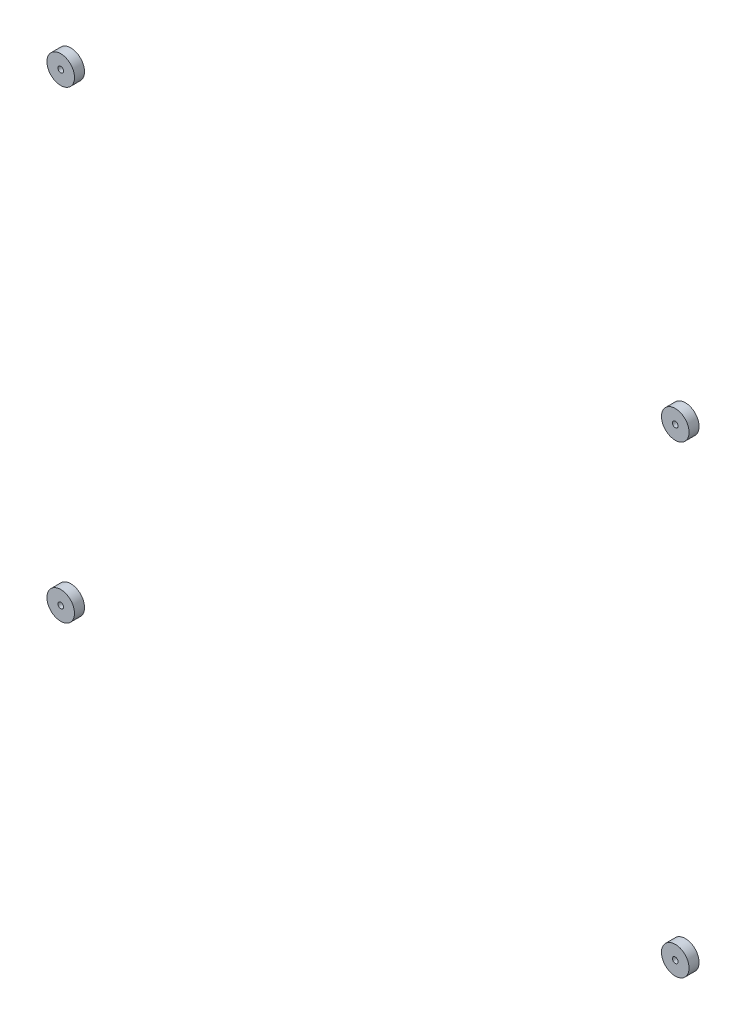
ISO-10303-21;
HEADER;
FILE_DESCRIPTION(('STEP AP214'),'2;1');
FILE_NAME('part.step','',(''),(''),'','','');
FILE_SCHEMA(('AUTOMOTIVE_DESIGN { 1 0 10303 214 1 1 1 1 }'));
ENDSEC;
DATA;
#1=APPLICATION_CONTEXT('core data for automotive mechanical design processes');
#2=APPLICATION_PROTOCOL_DEFINITION('international standard','automotive_design',2000,#1);
#3=PRODUCT_CONTEXT('',#1,'mechanical');
#4=PRODUCT('Part','Part','',(#3));
#5=PRODUCT_RELATED_PRODUCT_CATEGORY('part','',(#4));
#6=PRODUCT_DEFINITION_FORMATION('','',#4);
#7=PRODUCT_DEFINITION_CONTEXT('part definition',#1,'design');
#8=PRODUCT_DEFINITION('design','',#6,#7);
#9=PRODUCT_DEFINITION_SHAPE('','',#8);
#10=(LENGTH_UNIT() NAMED_UNIT(*) SI_UNIT(.MILLI.,.METRE.));
#11=(NAMED_UNIT(*) PLANE_ANGLE_UNIT() SI_UNIT($,.RADIAN.));
#12=(NAMED_UNIT(*) SI_UNIT($,.STERADIAN.) SOLID_ANGLE_UNIT());
#13=UNCERTAINTY_MEASURE_WITH_UNIT(LENGTH_MEASURE(1.E-05),#10,'distance_accuracy_value','');
#14=(GEOMETRIC_REPRESENTATION_CONTEXT(3) GLOBAL_UNCERTAINTY_ASSIGNED_CONTEXT((#13)) GLOBAL_UNIT_ASSIGNED_CONTEXT((#10,
#11,#12)) REPRESENTATION_CONTEXT('',''));
#15=CARTESIAN_POINT('',(0.,0.,0.));
#16=DIRECTION('',(0.,0.,1.));
#17=DIRECTION('',(1.,0.,0.));
#18=AXIS2_PLACEMENT_3D('',#15,#16,#17);
#19=CARTESIAN_POINT('',(-245.,-185.,118.));
#20=DIRECTION('',(0.,0.,1.));
#21=DIRECTION('',(1.,0.,0.));
#22=AXIS2_PLACEMENT_3D('',#19,#20,#21);
#23=PLANE('',#22);
#24=CARTESIAN_POINT('',(-245.,-185.,118.));
#25=DIRECTION('',(0.,0.,1.));
#26=DIRECTION('',(1.,0.,0.));
#27=AXIS2_PLACEMENT_3D('',#24,#25,#26);
#28=CIRCLE('',#27,2.25);
#29=CARTESIAN_POINT('',(-242.75,-185.,118.));
#30=VERTEX_POINT('',#29);
#31=EDGE_CURVE('P0_E32',#30,#30,#28,.T.);
#32=ORIENTED_EDGE('',*,*,#31,.F.);
#33=EDGE_LOOP('',(#32));
#34=FACE_BOUND('',#33,.T.);
#35=CARTESIAN_POINT('',(-245.,-185.,118.));
#36=DIRECTION('',(0.,0.,-1.));
#37=DIRECTION('',(-1.,0.,0.));
#38=AXIS2_PLACEMENT_3D('',#35,#36,#37);
#39=CIRCLE('',#38,11.);
#40=CARTESIAN_POINT('',(-256.,-185.,118.));
#41=VERTEX_POINT('',#40);
#42=EDGE_CURVE('P0_E10',#41,#41,#39,.T.);
#43=ORIENTED_EDGE('',*,*,#42,.F.);
#44=EDGE_LOOP('',(#43));
#45=FACE_BOUND('',#44,.T.);
#46=ADVANCED_FACE('P0_F15',(#34,#45),#23,.T.);
#47=CARTESIAN_POINT('',(-245.,-185.,110.));
#48=DIRECTION('',(0.,0.,-1.));
#49=DIRECTION('',(-1.,0.,0.));
#50=AXIS2_PLACEMENT_3D('',#47,#48,#49);
#51=PLANE('',#50);
#52=CARTESIAN_POINT('',(-245.,-185.,110.));
#53=DIRECTION('',(0.,0.,-1.));
#54=DIRECTION('',(-1.,0.,0.));
#55=AXIS2_PLACEMENT_3D('',#52,#53,#54);
#56=CIRCLE('',#55,2.25);
#57=CARTESIAN_POINT('',(-247.25,-185.,110.));
#58=VERTEX_POINT('',#57);
#59=EDGE_CURVE('P0_E19',#58,#58,#56,.T.);
#60=ORIENTED_EDGE('',*,*,#59,.F.);
#61=EDGE_LOOP('',(#60));
#62=FACE_BOUND('',#61,.T.);
#63=CARTESIAN_POINT('',(-245.,-185.,110.));
#64=DIRECTION('',(0.,0.,1.));
#65=DIRECTION('',(1.,0.,0.));
#66=AXIS2_PLACEMENT_3D('',#63,#64,#65);
#67=CIRCLE('',#66,11.);
#68=CARTESIAN_POINT('',(-234.,-185.,110.));
#69=VERTEX_POINT('',#68);
#70=EDGE_CURVE('P0_E24',#69,#69,#67,.T.);
#71=ORIENTED_EDGE('',*,*,#70,.F.);
#72=EDGE_LOOP('',(#71));
#73=FACE_BOUND('',#72,.T.);
#74=ADVANCED_FACE('P0_F43',(#62,#73),#51,.T.);
#75=CARTESIAN_POINT('',(-245.,-185.,110.));
#76=DIRECTION('',(0.,0.,1.));
#77=DIRECTION('',(1.,0.,0.));
#78=AXIS2_PLACEMENT_3D('',#75,#76,#77);
#79=CYLINDRICAL_SURFACE('',#78,11.);
#80=ORIENTED_EDGE('',*,*,#42,.T.);
#81=EDGE_LOOP('',(#80));
#82=FACE_BOUND('',#81,.T.);
#83=ORIENTED_EDGE('',*,*,#70,.T.);
#84=EDGE_LOOP('',(#83));
#85=FACE_BOUND('',#84,.T.);
#86=ADVANCED_FACE('P0_F17',(#82,#85),#79,.T.);
#87=CARTESIAN_POINT('',(-245.,-185.,109.7));
#88=DIRECTION('',(0.,0.,1.));
#89=DIRECTION('',(1.,0.,0.));
#90=AXIS2_PLACEMENT_3D('',#87,#88,#89);
#91=CYLINDRICAL_SURFACE('',#90,2.25);
#92=ORIENTED_EDGE('',*,*,#31,.T.);
#93=EDGE_LOOP('',(#92));
#94=FACE_BOUND('',#93,.T.);
#95=ORIENTED_EDGE('',*,*,#59,.T.);
#96=EDGE_LOOP('',(#95));
#97=FACE_BOUND('',#96,.T.);
#98=ADVANCED_FACE('P0_F41',(#94,#97),#91,.F.);
#99=CLOSED_SHELL('',(#46,#74,#86,#98));
#100=MANIFOLD_SOLID_BREP('P0_B1',#99);
#101=CARTESIAN_POINT('',(-245.,185.,118.));
#102=DIRECTION('',(0.,0.,1.));
#103=DIRECTION('',(1.,0.,0.));
#104=AXIS2_PLACEMENT_3D('',#101,#102,#103);
#105=PLANE('',#104);
#106=CARTESIAN_POINT('',(-245.,185.,118.));
#107=DIRECTION('',(0.,0.,1.));
#108=DIRECTION('',(1.,0.,0.));
#109=AXIS2_PLACEMENT_3D('',#106,#107,#108);
#110=CIRCLE('',#109,2.25);
#111=CARTESIAN_POINT('',(-242.75,185.,118.));
#112=VERTEX_POINT('',#111);
#113=EDGE_CURVE('P1_E31',#112,#112,#110,.T.);
#114=ORIENTED_EDGE('',*,*,#113,.F.);
#115=EDGE_LOOP('',(#114));
#116=FACE_BOUND('',#115,.T.);
#117=CARTESIAN_POINT('',(-245.,185.,118.));
#118=DIRECTION('',(0.,0.,-1.));
#119=DIRECTION('',(-1.,0.,0.));
#120=AXIS2_PLACEMENT_3D('',#117,#118,#119);
#121=CIRCLE('',#120,11.);
#122=CARTESIAN_POINT('',(-256.,185.,118.));
#123=VERTEX_POINT('',#122);
#124=EDGE_CURVE('P1_E10',#123,#123,#121,.T.);
#125=ORIENTED_EDGE('',*,*,#124,.F.);
#126=EDGE_LOOP('',(#125));
#127=FACE_BOUND('',#126,.T.);
#128=ADVANCED_FACE('P1_F15',(#116,#127),#105,.T.);
#129=CARTESIAN_POINT('',(-245.,185.,110.));
#130=DIRECTION('',(0.,0.,-1.));
#131=DIRECTION('',(-1.,0.,0.));
#132=AXIS2_PLACEMENT_3D('',#129,#130,#131);
#133=PLANE('',#132);
#134=CARTESIAN_POINT('',(-245.,185.,110.));
#135=DIRECTION('',(0.,0.,-1.));
#136=DIRECTION('',(-1.,0.,0.));
#137=AXIS2_PLACEMENT_3D('',#134,#135,#136);
#138=CIRCLE('',#137,2.25);
#139=CARTESIAN_POINT('',(-247.25,185.,110.));
#140=VERTEX_POINT('',#139);
#141=EDGE_CURVE('P1_E19',#140,#140,#138,.T.);
#142=ORIENTED_EDGE('',*,*,#141,.F.);
#143=EDGE_LOOP('',(#142));
#144=FACE_BOUND('',#143,.T.);
#145=CARTESIAN_POINT('',(-245.,185.,110.));
#146=DIRECTION('',(0.,0.,1.));
#147=DIRECTION('',(1.,0.,0.));
#148=AXIS2_PLACEMENT_3D('',#145,#146,#147);
#149=CIRCLE('',#148,11.);
#150=CARTESIAN_POINT('',(-234.,185.,110.));
#151=VERTEX_POINT('',#150);
#152=EDGE_CURVE('P1_E24',#151,#151,#149,.T.);
#153=ORIENTED_EDGE('',*,*,#152,.F.);
#154=EDGE_LOOP('',(#153));
#155=FACE_BOUND('',#154,.T.);
#156=ADVANCED_FACE('P1_F43',(#144,#155),#133,.T.);
#157=CARTESIAN_POINT('',(-245.,185.,110.));
#158=DIRECTION('',(0.,0.,1.));
#159=DIRECTION('',(1.,0.,0.));
#160=AXIS2_PLACEMENT_3D('',#157,#158,#159);
#161=CYLINDRICAL_SURFACE('',#160,11.);
#162=ORIENTED_EDGE('',*,*,#124,.T.);
#163=EDGE_LOOP('',(#162));
#164=FACE_BOUND('',#163,.T.);
#165=ORIENTED_EDGE('',*,*,#152,.T.);
#166=EDGE_LOOP('',(#165));
#167=FACE_BOUND('',#166,.T.);
#168=ADVANCED_FACE('P1_F17',(#164,#167),#161,.T.);
#169=CARTESIAN_POINT('',(-245.,185.,109.7));
#170=DIRECTION('',(0.,0.,1.));
#171=DIRECTION('',(1.,0.,0.));
#172=AXIS2_PLACEMENT_3D('',#169,#170,#171);
#173=CYLINDRICAL_SURFACE('',#172,2.25);
#174=ORIENTED_EDGE('',*,*,#113,.T.);
#175=EDGE_LOOP('',(#174));
#176=FACE_BOUND('',#175,.T.);
#177=ORIENTED_EDGE('',*,*,#141,.T.);
#178=EDGE_LOOP('',(#177));
#179=FACE_BOUND('',#178,.T.);
#180=ADVANCED_FACE('P1_F41',(#176,#179),#173,.F.);
#181=CLOSED_SHELL('',(#128,#156,#168,#180));
#182=MANIFOLD_SOLID_BREP('P1_B1',#181);
#183=CARTESIAN_POINT('',(245.,-185.,118.));
#184=DIRECTION('',(0.,0.,1.));
#185=DIRECTION('',(1.,0.,0.));
#186=AXIS2_PLACEMENT_3D('',#183,#184,#185);
#187=PLANE('',#186);
#188=CARTESIAN_POINT('',(245.,-185.,118.));
#189=DIRECTION('',(0.,0.,1.));
#190=DIRECTION('',(1.,0.,0.));
#191=AXIS2_PLACEMENT_3D('',#188,#189,#190);
#192=CIRCLE('',#191,2.25);
#193=CARTESIAN_POINT('',(247.25,-185.,118.));
#194=VERTEX_POINT('',#193);
#195=EDGE_CURVE('P2_E32',#194,#194,#192,.T.);
#196=ORIENTED_EDGE('',*,*,#195,.F.);
#197=EDGE_LOOP('',(#196));
#198=FACE_BOUND('',#197,.T.);
#199=CARTESIAN_POINT('',(245.,-185.,118.));
#200=DIRECTION('',(0.,0.,-1.));
#201=DIRECTION('',(-1.,0.,0.));
#202=AXIS2_PLACEMENT_3D('',#199,#200,#201);
#203=CIRCLE('',#202,11.);
#204=CARTESIAN_POINT('',(234.,-185.,118.));
#205=VERTEX_POINT('',#204);
#206=EDGE_CURVE('P2_E10',#205,#205,#203,.T.);
#207=ORIENTED_EDGE('',*,*,#206,.F.);
#208=EDGE_LOOP('',(#207));
#209=FACE_BOUND('',#208,.T.);
#210=ADVANCED_FACE('P2_F15',(#198,#209),#187,.T.);
#211=CARTESIAN_POINT('',(245.,-185.,110.));
#212=DIRECTION('',(0.,0.,-1.));
#213=DIRECTION('',(-1.,0.,0.));
#214=AXIS2_PLACEMENT_3D('',#211,#212,#213);
#215=PLANE('',#214);
#216=CARTESIAN_POINT('',(245.,-185.,110.));
#217=DIRECTION('',(0.,0.,-1.));
#218=DIRECTION('',(-1.,0.,0.));
#219=AXIS2_PLACEMENT_3D('',#216,#217,#218);
#220=CIRCLE('',#219,2.25);
#221=CARTESIAN_POINT('',(242.75,-185.,110.));
#222=VERTEX_POINT('',#221);
#223=EDGE_CURVE('P2_E19',#222,#222,#220,.T.);
#224=ORIENTED_EDGE('',*,*,#223,.F.);
#225=EDGE_LOOP('',(#224));
#226=FACE_BOUND('',#225,.T.);
#227=CARTESIAN_POINT('',(245.,-185.,110.));
#228=DIRECTION('',(0.,0.,1.));
#229=DIRECTION('',(1.,0.,0.));
#230=AXIS2_PLACEMENT_3D('',#227,#228,#229);
#231=CIRCLE('',#230,11.);
#232=CARTESIAN_POINT('',(256.,-185.,110.));
#233=VERTEX_POINT('',#232);
#234=EDGE_CURVE('P2_E24',#233,#233,#231,.T.);
#235=ORIENTED_EDGE('',*,*,#234,.F.);
#236=EDGE_LOOP('',(#235));
#237=FACE_BOUND('',#236,.T.);
#238=ADVANCED_FACE('P2_F43',(#226,#237),#215,.T.);
#239=CARTESIAN_POINT('',(245.,-185.,110.));
#240=DIRECTION('',(0.,0.,1.));
#241=DIRECTION('',(1.,0.,0.));
#242=AXIS2_PLACEMENT_3D('',#239,#240,#241);
#243=CYLINDRICAL_SURFACE('',#242,11.);
#244=ORIENTED_EDGE('',*,*,#206,.T.);
#245=EDGE_LOOP('',(#244));
#246=FACE_BOUND('',#245,.T.);
#247=ORIENTED_EDGE('',*,*,#234,.T.);
#248=EDGE_LOOP('',(#247));
#249=FACE_BOUND('',#248,.T.);
#250=ADVANCED_FACE('P2_F17',(#246,#249),#243,.T.);
#251=CARTESIAN_POINT('',(245.,-185.,109.7));
#252=DIRECTION('',(0.,0.,1.));
#253=DIRECTION('',(1.,0.,0.));
#254=AXIS2_PLACEMENT_3D('',#251,#252,#253);
#255=CYLINDRICAL_SURFACE('',#254,2.25);
#256=ORIENTED_EDGE('',*,*,#195,.T.);
#257=EDGE_LOOP('',(#256));
#258=FACE_BOUND('',#257,.T.);
#259=ORIENTED_EDGE('',*,*,#223,.T.);
#260=EDGE_LOOP('',(#259));
#261=FACE_BOUND('',#260,.T.);
#262=ADVANCED_FACE('P2_F41',(#258,#261),#255,.F.);
#263=CLOSED_SHELL('',(#210,#238,#250,#262));
#264=MANIFOLD_SOLID_BREP('P2_B1',#263);
#265=CARTESIAN_POINT('',(245.,185.,118.));
#266=DIRECTION('',(0.,0.,1.));
#267=DIRECTION('',(1.,0.,0.));
#268=AXIS2_PLACEMENT_3D('',#265,#266,#267);
#269=PLANE('',#268);
#270=CARTESIAN_POINT('',(245.,185.,118.));
#271=DIRECTION('',(0.,0.,1.));
#272=DIRECTION('',(1.,0.,0.));
#273=AXIS2_PLACEMENT_3D('',#270,#271,#272);
#274=CIRCLE('',#273,2.25);
#275=CARTESIAN_POINT('',(247.25,185.,118.));
#276=VERTEX_POINT('',#275);
#277=EDGE_CURVE('P3_E30',#276,#276,#274,.T.);
#278=ORIENTED_EDGE('',*,*,#277,.F.);
#279=EDGE_LOOP('',(#278));
#280=FACE_BOUND('',#279,.T.);
#281=CARTESIAN_POINT('',(245.,185.,118.));
#282=DIRECTION('',(0.,0.,-1.));
#283=DIRECTION('',(-1.,0.,0.));
#284=AXIS2_PLACEMENT_3D('',#281,#282,#283);
#285=CIRCLE('',#284,11.);
#286=CARTESIAN_POINT('',(234.,185.,118.));
#287=VERTEX_POINT('',#286);
#288=EDGE_CURVE('P3_E10',#287,#287,#285,.T.);
#289=ORIENTED_EDGE('',*,*,#288,.F.);
#290=EDGE_LOOP('',(#289));
#291=FACE_BOUND('',#290,.T.);
#292=ADVANCED_FACE('P3_F15',(#280,#291),#269,.T.);
#293=CARTESIAN_POINT('',(245.,185.,110.));
#294=DIRECTION('',(0.,0.,-1.));
#295=DIRECTION('',(-1.,0.,0.));
#296=AXIS2_PLACEMENT_3D('',#293,#294,#295);
#297=PLANE('',#296);
#298=CARTESIAN_POINT('',(245.,185.,110.));
#299=DIRECTION('',(0.,0.,-1.));
#300=DIRECTION('',(-1.,0.,0.));
#301=AXIS2_PLACEMENT_3D('',#298,#299,#300);
#302=CIRCLE('',#301,2.25);
#303=CARTESIAN_POINT('',(242.75,185.,110.));
#304=VERTEX_POINT('',#303);
#305=EDGE_CURVE('P3_E19',#304,#304,#302,.T.);
#306=ORIENTED_EDGE('',*,*,#305,.F.);
#307=EDGE_LOOP('',(#306));
#308=FACE_BOUND('',#307,.T.);
#309=CARTESIAN_POINT('',(245.,185.,110.));
#310=DIRECTION('',(0.,0.,1.));
#311=DIRECTION('',(1.,0.,0.));
#312=AXIS2_PLACEMENT_3D('',#309,#310,#311);
#313=CIRCLE('',#312,11.);
#314=CARTESIAN_POINT('',(256.,185.,110.));
#315=VERTEX_POINT('',#314);
#316=EDGE_CURVE('P3_E24',#315,#315,#313,.T.);
#317=ORIENTED_EDGE('',*,*,#316,.F.);
#318=EDGE_LOOP('',(#317));
#319=FACE_BOUND('',#318,.T.);
#320=ADVANCED_FACE('P3_F43',(#308,#319),#297,.T.);
#321=CARTESIAN_POINT('',(245.,185.,110.));
#322=DIRECTION('',(0.,0.,1.));
#323=DIRECTION('',(1.,0.,0.));
#324=AXIS2_PLACEMENT_3D('',#321,#322,#323);
#325=CYLINDRICAL_SURFACE('',#324,11.);
#326=ORIENTED_EDGE('',*,*,#288,.T.);
#327=EDGE_LOOP('',(#326));
#328=FACE_BOUND('',#327,.T.);
#329=ORIENTED_EDGE('',*,*,#316,.T.);
#330=EDGE_LOOP('',(#329));
#331=FACE_BOUND('',#330,.T.);
#332=ADVANCED_FACE('P3_F17',(#328,#331),#325,.T.);
#333=CARTESIAN_POINT('',(245.,185.,109.7));
#334=DIRECTION('',(0.,0.,1.));
#335=DIRECTION('',(1.,0.,0.));
#336=AXIS2_PLACEMENT_3D('',#333,#334,#335);
#337=CYLINDRICAL_SURFACE('',#336,2.25);
#338=ORIENTED_EDGE('',*,*,#277,.T.);
#339=EDGE_LOOP('',(#338));
#340=FACE_BOUND('',#339,.T.);
#341=ORIENTED_EDGE('',*,*,#305,.T.);
#342=EDGE_LOOP('',(#341));
#343=FACE_BOUND('',#342,.T.);
#344=ADVANCED_FACE('P3_F41',(#340,#343),#337,.F.);
#345=CLOSED_SHELL('',(#292,#320,#332,#344));
#346=MANIFOLD_SOLID_BREP('P3_B1',#345);
#347=ADVANCED_BREP_SHAPE_REPRESENTATION('',(#18,#100,#182,#264,#346),#14);
#348=SHAPE_DEFINITION_REPRESENTATION(#9,#347);
ENDSEC;
END-ISO-10303-21;
